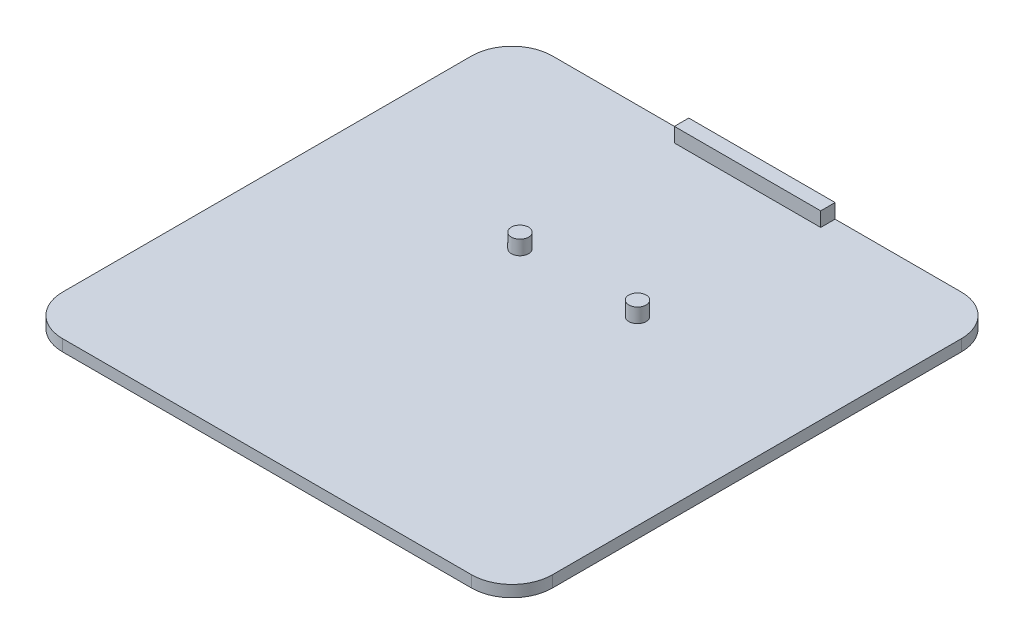
ISO-10303-21;
HEADER;
FILE_DESCRIPTION(('STEP AP214'),'2;1');
FILE_NAME('part.step','',(''),(''),'','','');
FILE_SCHEMA(('AUTOMOTIVE_DESIGN { 1 0 10303 214 1 1 1 1 }'));
ENDSEC;
DATA;
#1=APPLICATION_CONTEXT('core data for automotive mechanical design processes');
#2=APPLICATION_PROTOCOL_DEFINITION('international standard','automotive_design',2000,#1);
#3=PRODUCT_CONTEXT('',#1,'mechanical');
#4=PRODUCT('Part','Part','',(#3));
#5=PRODUCT_RELATED_PRODUCT_CATEGORY('part','',(#4));
#6=PRODUCT_DEFINITION_FORMATION('','',#4);
#7=PRODUCT_DEFINITION_CONTEXT('part definition',#1,'design');
#8=PRODUCT_DEFINITION('design','',#6,#7);
#9=PRODUCT_DEFINITION_SHAPE('','',#8);
#10=(LENGTH_UNIT() NAMED_UNIT(*) SI_UNIT(.MILLI.,.METRE.));
#11=(NAMED_UNIT(*) PLANE_ANGLE_UNIT() SI_UNIT($,.RADIAN.));
#12=(NAMED_UNIT(*) SI_UNIT($,.STERADIAN.) SOLID_ANGLE_UNIT());
#13=UNCERTAINTY_MEASURE_WITH_UNIT(LENGTH_MEASURE(1.E-05),#10,'distance_accuracy_value','');
#14=(GEOMETRIC_REPRESENTATION_CONTEXT(3) GLOBAL_UNCERTAINTY_ASSIGNED_CONTEXT((#13)) GLOBAL_UNIT_ASSIGNED_CONTEXT((#10,
#11,#12)) REPRESENTATION_CONTEXT('',''));
#15=CARTESIAN_POINT('',(0.,0.,0.));
#16=DIRECTION('',(0.,0.,1.));
#17=DIRECTION('',(1.,0.,0.));
#18=AXIS2_PLACEMENT_3D('',#15,#16,#17);
#19=CARTESIAN_POINT('',(-35.8924902419984,2.,-51.4777205308353));
#20=DIRECTION('',(0.,-1.,0.));
#21=DIRECTION('',(0.,0.,-1.));
#22=AXIS2_PLACEMENT_3D('',#19,#20,#21);
#23=PLANE('',#22);
#24=CARTESIAN_POINT('',(-9.71157857923494,2.,-26.6789603219462));
#25=DIRECTION('',(0.,-1.,0.));
#26=DIRECTION('',(0.,0.,-1.));
#27=AXIS2_PLACEMENT_3D('',#24,#25,#26);
#28=CIRCLE('',#27,1.5);
#29=CARTESIAN_POINT('',(-9.71157857923494,2.,-28.1789603219462));
#30=VERTEX_POINT('',#29);
#31=EDGE_CURVE('E41',#30,#30,#28,.F.);
#32=ORIENTED_EDGE('',*,*,#31,.F.);
#33=EDGE_LOOP('',(#32));
#34=FACE_BOUND('',#33,.T.);
#35=CARTESIAN_POINT('',(10.6884214207651,2.,-26.6789603219462));
#36=DIRECTION('',(0.,-1.,0.));
#37=DIRECTION('',(0.,0.,-1.));
#38=AXIS2_PLACEMENT_3D('',#35,#36,#37);
#39=CIRCLE('',#38,1.5);
#40=CARTESIAN_POINT('',(10.6884214207651,2.,-28.1789603219462));
#41=VERTEX_POINT('',#40);
#42=EDGE_CURVE('E11',#41,#41,#39,.F.);
#43=ORIENTED_EDGE('',*,*,#42,.F.);
#44=EDGE_LOOP('',(#43));
#45=FACE_BOUND('',#44,.T.);
#46=DIRECTION('',(0.,0.,1.));
#47=VECTOR('',#46,1.);
#48=CARTESIAN_POINT('',(-12.2115785792349,2.,-58.4777205308353));
#49=LINE('',#48,#47);
#50=CARTESIAN_POINT('',(-12.2115785792349,2.,-58.4777205308353));
#51=VERTEX_POINT('',#50);
#52=CARTESIAN_POINT('',(-12.2115785792349,2.,-55.9777205308353));
#53=VERTEX_POINT('',#52);
#54=EDGE_CURVE('E221',#51,#53,#49,.T.);
#55=ORIENTED_EDGE('',*,*,#54,.F.);
#56=DIRECTION('',(-1.,0.,0.));
#57=VECTOR('',#56,1.);
#58=CARTESIAN_POINT('',(35.1075097580015,2.,-58.4777205308353));
#59=LINE('',#58,#57);
#60=CARTESIAN_POINT('',(-35.8924902419984,2.,-58.4777205308353));
#61=VERTEX_POINT('',#60);
#62=EDGE_CURVE('E143',#51,#61,#59,.T.);
#63=ORIENTED_EDGE('',*,*,#62,.T.);
#64=CARTESIAN_POINT('',(-35.8924902419984,2.,-51.4777205308353));
#65=DIRECTION('',(0.,1.,0.));
#66=DIRECTION('',(0.,0.,-1.));
#67=AXIS2_PLACEMENT_3D('',#64,#65,#66);
#68=CIRCLE('',#67,7.);
#69=CARTESIAN_POINT('',(-42.8924902419984,2.,-51.4777205308353));
#70=VERTEX_POINT('',#69);
#71=EDGE_CURVE('E156',#61,#70,#68,.T.);
#72=ORIENTED_EDGE('',*,*,#71,.T.);
#73=DIRECTION('',(0.,0.,1.));
#74=VECTOR('',#73,1.);
#75=CARTESIAN_POINT('',(-42.8924902419984,2.,-51.4777205308353));
#76=LINE('',#75,#74);
#77=CARTESIAN_POINT('',(-42.8924902419984,2.,19.5222794691647));
#78=VERTEX_POINT('',#77);
#79=EDGE_CURVE('E159',#70,#78,#76,.T.);
#80=ORIENTED_EDGE('',*,*,#79,.T.);
#81=CARTESIAN_POINT('',(-35.8924902419984,2.,19.5222794691647));
#82=DIRECTION('',(0.,1.,0.));
#83=DIRECTION('',(0.,0.,1.));
#84=AXIS2_PLACEMENT_3D('',#81,#82,#83);
#85=CIRCLE('',#84,7.);
#86=CARTESIAN_POINT('',(-35.8924902419984,2.,26.5222794691647));
#87=VERTEX_POINT('',#86);
#88=EDGE_CURVE('E162',#78,#87,#85,.T.);
#89=ORIENTED_EDGE('',*,*,#88,.T.);
#90=DIRECTION('',(1.,0.,0.));
#91=VECTOR('',#90,1.);
#92=CARTESIAN_POINT('',(-35.8924902419984,2.,26.5222794691647));
#93=LINE('',#92,#91);
#94=CARTESIAN_POINT('',(35.1075097580015,2.,26.5222794691647));
#95=VERTEX_POINT('',#94);
#96=EDGE_CURVE('E164',#87,#95,#93,.T.);
#97=ORIENTED_EDGE('',*,*,#96,.T.);
#98=CARTESIAN_POINT('',(35.1075097580016,2.,19.5222794691647));
#99=DIRECTION('',(0.,1.,0.));
#100=DIRECTION('',(0.,0.,1.));
#101=AXIS2_PLACEMENT_3D('',#98,#99,#100);
#102=CIRCLE('',#101,7.);
#103=CARTESIAN_POINT('',(42.1075097580016,2.,19.5222794691647));
#104=VERTEX_POINT('',#103);
#105=EDGE_CURVE('E166',#95,#104,#102,.T.);
#106=ORIENTED_EDGE('',*,*,#105,.T.);
#107=DIRECTION('',(0.,0.,-1.));
#108=VECTOR('',#107,1.);
#109=CARTESIAN_POINT('',(42.1075097580016,2.,19.5222794691647));
#110=LINE('',#109,#108);
#111=CARTESIAN_POINT('',(42.1075097580016,2.,-51.4777205308353));
#112=VERTEX_POINT('',#111);
#113=EDGE_CURVE('E168',#104,#112,#110,.T.);
#114=ORIENTED_EDGE('',*,*,#113,.T.);
#115=CARTESIAN_POINT('',(35.1075097580016,2.,-51.4777205308353));
#116=DIRECTION('',(0.,1.,0.));
#117=DIRECTION('',(0.,0.,1.));
#118=AXIS2_PLACEMENT_3D('',#115,#116,#117);
#119=CIRCLE('',#118,7.);
#120=CARTESIAN_POINT('',(35.1075097580015,2.,-58.4777205308353));
#121=VERTEX_POINT('',#120);
#122=EDGE_CURVE('E170',#112,#121,#119,.T.);
#123=ORIENTED_EDGE('',*,*,#122,.T.);
#124=CARTESIAN_POINT('',(13.1884214207651,2.,-58.4777205308353));
#125=VERTEX_POINT('',#124);
#126=EDGE_CURVE('E172',#121,#125,#59,.T.);
#127=ORIENTED_EDGE('',*,*,#126,.T.);
#128=DIRECTION('',(0.,0.,-1.));
#129=VECTOR('',#128,1.);
#130=CARTESIAN_POINT('',(13.1884214207651,2.,-55.9777205308353));
#131=LINE('',#130,#129);
#132=CARTESIAN_POINT('',(13.1884214207651,2.,-55.9777205308353));
#133=VERTEX_POINT('',#132);
#134=EDGE_CURVE('E53',#133,#125,#131,.T.);
#135=ORIENTED_EDGE('',*,*,#134,.F.);
#136=DIRECTION('',(1.,0.,0.));
#137=VECTOR('',#136,1.);
#138=CARTESIAN_POINT('',(-12.2115785792349,2.,-55.9777205308353));
#139=LINE('',#138,#137);
#140=EDGE_CURVE('E48',#53,#133,#139,.T.);
#141=ORIENTED_EDGE('',*,*,#140,.F.);
#142=EDGE_LOOP('',(#55,#63,#72,#80,#89,#97,#106,#114,#123,#127,#135,#141));
#143=FACE_BOUND('',#142,.T.);
#144=ADVANCED_FACE('F33',(#34,#45,#143),#23,.F.);
#145=CARTESIAN_POINT('',(-35.8924902419984,2.,-51.4777205308353));
#146=DIRECTION('',(0.,-1.,0.));
#147=DIRECTION('',(0.,0.,-1.));
#148=AXIS2_PLACEMENT_3D('',#145,#146,#147);
#149=CYLINDRICAL_SURFACE('',#148,7.);
#150=CARTESIAN_POINT('',(-35.8924902419984,0.,-51.4777205308353));
#151=DIRECTION('',(0.,1.,0.));
#152=DIRECTION('',(0.,0.,-1.));
#153=AXIS2_PLACEMENT_3D('',#150,#151,#152);
#154=CIRCLE('',#153,7.);
#155=CARTESIAN_POINT('',(-35.8924902419984,0.,-58.4777205308353));
#156=VERTEX_POINT('',#155);
#157=CARTESIAN_POINT('',(-42.8924902419984,0.,-51.4777205308353));
#158=VERTEX_POINT('',#157);
#159=EDGE_CURVE('E155',#156,#158,#154,.T.);
#160=ORIENTED_EDGE('',*,*,#159,.T.);
#161=DIRECTION('',(0.,-1.,0.));
#162=VECTOR('',#161,1.);
#163=CARTESIAN_POINT('',(-42.8924902419984,2.,-51.4777205308353));
#164=LINE('',#163,#162);
#165=EDGE_CURVE('E210',#70,#158,#164,.T.);
#166=ORIENTED_EDGE('',*,*,#165,.F.);
#167=ORIENTED_EDGE('',*,*,#71,.F.);
#168=DIRECTION('',(0.,-1.,0.));
#169=VECTOR('',#168,1.);
#170=CARTESIAN_POINT('',(-35.8924902419984,2.,-58.4777205308353));
#171=LINE('',#170,#169);
#172=EDGE_CURVE('E174',#61,#156,#171,.T.);
#173=ORIENTED_EDGE('',*,*,#172,.T.);
#174=EDGE_LOOP('',(#160,#166,#167,#173));
#175=FACE_BOUND('',#174,.T.);
#176=ADVANCED_FACE('F35',(#175),#149,.T.);
#177=CARTESIAN_POINT('',(-42.8924902419984,2.,-51.4777205308353));
#178=DIRECTION('',(1.,0.,0.));
#179=DIRECTION('',(0.,0.,-1.));
#180=AXIS2_PLACEMENT_3D('',#177,#178,#179);
#181=PLANE('',#180);
#182=DIRECTION('',(0.,0.,1.));
#183=VECTOR('',#182,1.);
#184=CARTESIAN_POINT('',(-42.8924902419984,0.,-51.4777205308353));
#185=LINE('',#184,#183);
#186=CARTESIAN_POINT('',(-42.8924902419984,0.,19.5222794691647));
#187=VERTEX_POINT('',#186);
#188=EDGE_CURVE('E177',#158,#187,#185,.T.);
#189=ORIENTED_EDGE('',*,*,#188,.T.);
#190=DIRECTION('',(0.,-1.,0.));
#191=VECTOR('',#190,1.);
#192=CARTESIAN_POINT('',(-42.8924902419984,2.,19.5222794691647));
#193=LINE('',#192,#191);
#194=EDGE_CURVE('E207',#78,#187,#193,.T.);
#195=ORIENTED_EDGE('',*,*,#194,.F.);
#196=ORIENTED_EDGE('',*,*,#79,.F.);
#197=ORIENTED_EDGE('',*,*,#165,.T.);
#198=EDGE_LOOP('',(#189,#195,#196,#197));
#199=FACE_BOUND('',#198,.T.);
#200=ADVANCED_FACE('F284',(#199),#181,.F.);
#201=CARTESIAN_POINT('',(-35.8924902419984,2.,19.5222794691647));
#202=DIRECTION('',(0.,-1.,0.));
#203=DIRECTION('',(0.,0.,-1.));
#204=AXIS2_PLACEMENT_3D('',#201,#202,#203);
#205=CYLINDRICAL_SURFACE('',#204,7.);
#206=CARTESIAN_POINT('',(-35.8924902419984,0.,19.5222794691647));
#207=DIRECTION('',(0.,1.,0.));
#208=DIRECTION('',(0.,0.,1.));
#209=AXIS2_PLACEMENT_3D('',#206,#207,#208);
#210=CIRCLE('',#209,7.);
#211=CARTESIAN_POINT('',(-35.8924902419984,0.,26.5222794691647));
#212=VERTEX_POINT('',#211);
#213=EDGE_CURVE('E179',#187,#212,#210,.T.);
#214=ORIENTED_EDGE('',*,*,#213,.T.);
#215=DIRECTION('',(0.,-1.,0.));
#216=VECTOR('',#215,1.);
#217=CARTESIAN_POINT('',(-35.8924902419984,2.,26.5222794691647));
#218=LINE('',#217,#216);
#219=EDGE_CURVE('E204',#87,#212,#218,.T.);
#220=ORIENTED_EDGE('',*,*,#219,.F.);
#221=ORIENTED_EDGE('',*,*,#88,.F.);
#222=ORIENTED_EDGE('',*,*,#194,.T.);
#223=EDGE_LOOP('',(#214,#220,#221,#222));
#224=FACE_BOUND('',#223,.T.);
#225=ADVANCED_FACE('F281',(#224),#205,.T.);
#226=CARTESIAN_POINT('',(-35.8924902419984,2.,26.5222794691647));
#227=DIRECTION('',(0.,0.,-1.));
#228=DIRECTION('',(-1.,0.,0.));
#229=AXIS2_PLACEMENT_3D('',#226,#227,#228);
#230=PLANE('',#229);
#231=DIRECTION('',(1.,0.,0.));
#232=VECTOR('',#231,1.);
#233=CARTESIAN_POINT('',(-35.8924902419984,0.,26.5222794691647));
#234=LINE('',#233,#232);
#235=CARTESIAN_POINT('',(35.1075097580015,0.,26.5222794691647));
#236=VERTEX_POINT('',#235);
#237=EDGE_CURVE('E181',#212,#236,#234,.T.);
#238=ORIENTED_EDGE('',*,*,#237,.T.);
#239=DIRECTION('',(0.,-1.,0.));
#240=VECTOR('',#239,1.);
#241=CARTESIAN_POINT('',(35.1075097580015,2.,26.5222794691647));
#242=LINE('',#241,#240);
#243=EDGE_CURVE('E201',#95,#236,#242,.T.);
#244=ORIENTED_EDGE('',*,*,#243,.F.);
#245=ORIENTED_EDGE('',*,*,#96,.F.);
#246=ORIENTED_EDGE('',*,*,#219,.T.);
#247=EDGE_LOOP('',(#238,#244,#245,#246));
#248=FACE_BOUND('',#247,.T.);
#249=ADVANCED_FACE('F277',(#248),#230,.F.);
#250=CARTESIAN_POINT('',(35.1075097580016,2.,19.5222794691647));
#251=DIRECTION('',(0.,-1.,0.));
#252=DIRECTION('',(0.,0.,-1.));
#253=AXIS2_PLACEMENT_3D('',#250,#251,#252);
#254=CYLINDRICAL_SURFACE('',#253,7.);
#255=CARTESIAN_POINT('',(35.1075097580016,0.,19.5222794691647));
#256=DIRECTION('',(0.,1.,0.));
#257=DIRECTION('',(0.,0.,1.));
#258=AXIS2_PLACEMENT_3D('',#255,#256,#257);
#259=CIRCLE('',#258,7.);
#260=CARTESIAN_POINT('',(42.1075097580016,0.,19.5222794691647));
#261=VERTEX_POINT('',#260);
#262=EDGE_CURVE('E183',#236,#261,#259,.T.);
#263=ORIENTED_EDGE('',*,*,#262,.T.);
#264=DIRECTION('',(0.,-1.,0.));
#265=VECTOR('',#264,1.);
#266=CARTESIAN_POINT('',(42.1075097580016,2.,19.5222794691647));
#267=LINE('',#266,#265);
#268=EDGE_CURVE('E198',#104,#261,#267,.T.);
#269=ORIENTED_EDGE('',*,*,#268,.F.);
#270=ORIENTED_EDGE('',*,*,#105,.F.);
#271=ORIENTED_EDGE('',*,*,#243,.T.);
#272=EDGE_LOOP('',(#263,#269,#270,#271));
#273=FACE_BOUND('',#272,.T.);
#274=ADVANCED_FACE('F273',(#273),#254,.T.);
#275=CARTESIAN_POINT('',(42.1075097580016,2.,19.5222794691647));
#276=DIRECTION('',(-1.,0.,0.));
#277=DIRECTION('',(0.,0.,1.));
#278=AXIS2_PLACEMENT_3D('',#275,#276,#277);
#279=PLANE('',#278);
#280=DIRECTION('',(0.,0.,-1.));
#281=VECTOR('',#280,1.);
#282=CARTESIAN_POINT('',(42.1075097580016,0.,19.5222794691647));
#283=LINE('',#282,#281);
#284=CARTESIAN_POINT('',(42.1075097580016,0.,-51.4777205308353));
#285=VERTEX_POINT('',#284);
#286=EDGE_CURVE('E185',#261,#285,#283,.T.);
#287=ORIENTED_EDGE('',*,*,#286,.T.);
#288=DIRECTION('',(0.,-1.,0.));
#289=VECTOR('',#288,1.);
#290=CARTESIAN_POINT('',(42.1075097580016,2.,-51.4777205308353));
#291=LINE('',#290,#289);
#292=EDGE_CURVE('E195',#112,#285,#291,.T.);
#293=ORIENTED_EDGE('',*,*,#292,.F.);
#294=ORIENTED_EDGE('',*,*,#113,.F.);
#295=ORIENTED_EDGE('',*,*,#268,.T.);
#296=EDGE_LOOP('',(#287,#293,#294,#295));
#297=FACE_BOUND('',#296,.T.);
#298=ADVANCED_FACE('F269',(#297),#279,.F.);
#299=CARTESIAN_POINT('',(35.1075097580016,2.,-51.4777205308353));
#300=DIRECTION('',(0.,-1.,0.));
#301=DIRECTION('',(0.,0.,-1.));
#302=AXIS2_PLACEMENT_3D('',#299,#300,#301);
#303=CYLINDRICAL_SURFACE('',#302,7.);
#304=CARTESIAN_POINT('',(35.1075097580016,0.,-51.4777205308353));
#305=DIRECTION('',(0.,1.,0.));
#306=DIRECTION('',(0.,0.,1.));
#307=AXIS2_PLACEMENT_3D('',#304,#305,#306);
#308=CIRCLE('',#307,7.);
#309=CARTESIAN_POINT('',(35.1075097580015,0.,-58.4777205308353));
#310=VERTEX_POINT('',#309);
#311=EDGE_CURVE('E187',#285,#310,#308,.T.);
#312=ORIENTED_EDGE('',*,*,#311,.T.);
#313=DIRECTION('',(0.,-1.,0.));
#314=VECTOR('',#313,1.);
#315=CARTESIAN_POINT('',(35.1075097580015,2.,-58.4777205308353));
#316=LINE('',#315,#314);
#317=EDGE_CURVE('E192',#121,#310,#316,.T.);
#318=ORIENTED_EDGE('',*,*,#317,.F.);
#319=ORIENTED_EDGE('',*,*,#122,.F.);
#320=ORIENTED_EDGE('',*,*,#292,.T.);
#321=EDGE_LOOP('',(#312,#318,#319,#320));
#322=FACE_BOUND('',#321,.T.);
#323=ADVANCED_FACE('F266',(#322),#303,.T.);
#324=CARTESIAN_POINT('',(35.1075097580015,2.,-58.4777205308353));
#325=DIRECTION('',(0.,0.,1.));
#326=DIRECTION('',(1.,0.,0.));
#327=AXIS2_PLACEMENT_3D('',#324,#325,#326);
#328=PLANE('',#327);
#329=DIRECTION('',(-1.,0.,0.));
#330=VECTOR('',#329,1.);
#331=CARTESIAN_POINT('',(35.1075097580015,0.,-58.4777205308353));
#332=LINE('',#331,#330);
#333=EDGE_CURVE('E160',#310,#156,#332,.T.);
#334=ORIENTED_EDGE('',*,*,#333,.T.);
#335=ORIENTED_EDGE('',*,*,#172,.F.);
#336=ORIENTED_EDGE('',*,*,#62,.F.);
#337=DIRECTION('',(0.,-1.,0.));
#338=VECTOR('',#337,1.);
#339=CARTESIAN_POINT('',(-12.2115785792349,4.5,-58.4777205308353));
#340=LINE('',#339,#338);
#341=CARTESIAN_POINT('',(-12.2115785792349,4.5,-58.4777205308353));
#342=VERTEX_POINT('',#341);
#343=EDGE_CURVE('E124',#342,#51,#340,.T.);
#344=ORIENTED_EDGE('',*,*,#343,.F.);
#345=DIRECTION('',(-1.,0.,0.));
#346=VECTOR('',#345,1.);
#347=CARTESIAN_POINT('',(13.1884214207651,4.5,-58.4777205308353));
#348=LINE('',#347,#346);
#349=CARTESIAN_POINT('',(13.1884214207651,4.5,-58.4777205308353));
#350=VERTEX_POINT('',#349);
#351=EDGE_CURVE('E130',#350,#342,#348,.T.);
#352=ORIENTED_EDGE('',*,*,#351,.F.);
#353=DIRECTION('',(0.,-1.,0.));
#354=VECTOR('',#353,1.);
#355=CARTESIAN_POINT('',(13.1884214207651,4.5,-58.4777205308353));
#356=LINE('',#355,#354);
#357=EDGE_CURVE('E228',#350,#125,#356,.T.);
#358=ORIENTED_EDGE('',*,*,#357,.T.);
#359=ORIENTED_EDGE('',*,*,#126,.F.);
#360=ORIENTED_EDGE('',*,*,#317,.T.);
#361=EDGE_LOOP('',(#334,#335,#336,#344,#352,#358,#359,#360));
#362=FACE_BOUND('',#361,.T.);
#363=ADVANCED_FACE('F141',(#362),#328,.F.);
#364=CARTESIAN_POINT('',(-35.8924902419984,0.,-51.4777205308353));
#365=DIRECTION('',(0.,-1.,0.));
#366=DIRECTION('',(0.,0.,-1.));
#367=AXIS2_PLACEMENT_3D('',#364,#365,#366);
#368=PLANE('',#367);
#369=ORIENTED_EDGE('',*,*,#159,.F.);
#370=ORIENTED_EDGE('',*,*,#333,.F.);
#371=ORIENTED_EDGE('',*,*,#311,.F.);
#372=ORIENTED_EDGE('',*,*,#286,.F.);
#373=ORIENTED_EDGE('',*,*,#262,.F.);
#374=ORIENTED_EDGE('',*,*,#237,.F.);
#375=ORIENTED_EDGE('',*,*,#213,.F.);
#376=ORIENTED_EDGE('',*,*,#188,.F.);
#377=EDGE_LOOP('',(#369,#370,#371,#372,#373,#374,#375,#376));
#378=FACE_BOUND('',#377,.T.);
#379=ADVANCED_FACE('F258',(#378),#368,.T.);
#380=CARTESIAN_POINT('',(-9.71157857923494,4.5,-26.6789603219462));
#381=DIRECTION('',(0.,-1.,0.));
#382=DIRECTION('',(0.,0.,-1.));
#383=AXIS2_PLACEMENT_3D('',#380,#381,#382);
#384=CYLINDRICAL_SURFACE('',#383,1.5);
#385=CARTESIAN_POINT('',(-9.71157857923494,4.5,-26.6789603219462));
#386=DIRECTION('',(0.,1.,0.));
#387=DIRECTION('',(0.,0.,1.));
#388=AXIS2_PLACEMENT_3D('',#385,#386,#387);
#389=CIRCLE('',#388,1.5);
#390=CARTESIAN_POINT('',(-9.71157857923494,4.5,-25.1789603219463));
#391=VERTEX_POINT('',#390);
#392=EDGE_CURVE('E147',#391,#391,#389,.T.);
#393=ORIENTED_EDGE('',*,*,#392,.F.);
#394=EDGE_LOOP('',(#393));
#395=FACE_BOUND('',#394,.T.);
#396=ORIENTED_EDGE('',*,*,#31,.T.);
#397=EDGE_LOOP('',(#396));
#398=FACE_BOUND('',#397,.T.);
#399=ADVANCED_FACE('F215',(#395,#398),#384,.T.);
#400=CARTESIAN_POINT('',(-9.71157857923494,4.5,-26.6789603219462));
#401=DIRECTION('',(0.,1.,0.));
#402=DIRECTION('',(0.,0.,1.));
#403=AXIS2_PLACEMENT_3D('',#400,#401,#402);
#404=PLANE('',#403);
#405=ORIENTED_EDGE('',*,*,#392,.T.);
#406=EDGE_LOOP('',(#405));
#407=FACE_BOUND('',#406,.T.);
#408=ADVANCED_FACE('F252',(#407),#404,.T.);
#409=CARTESIAN_POINT('',(10.6884214207651,4.5,-26.6789603219462));
#410=DIRECTION('',(0.,-1.,0.));
#411=DIRECTION('',(0.,0.,-1.));
#412=AXIS2_PLACEMENT_3D('',#409,#410,#411);
#413=CYLINDRICAL_SURFACE('',#412,1.5);
#414=CARTESIAN_POINT('',(10.6884214207651,4.5,-26.6789603219462));
#415=DIRECTION('',(0.,1.,0.));
#416=DIRECTION('',(0.,0.,1.));
#417=AXIS2_PLACEMENT_3D('',#414,#415,#416);
#418=CIRCLE('',#417,1.5);
#419=CARTESIAN_POINT('',(10.6884214207651,4.5,-25.1789603219463));
#420=VERTEX_POINT('',#419);
#421=EDGE_CURVE('E144',#420,#420,#418,.T.);
#422=ORIENTED_EDGE('',*,*,#421,.F.);
#423=EDGE_LOOP('',(#422));
#424=FACE_BOUND('',#423,.T.);
#425=ORIENTED_EDGE('',*,*,#42,.T.);
#426=EDGE_LOOP('',(#425));
#427=FACE_BOUND('',#426,.T.);
#428=ADVANCED_FACE('F248',(#424,#427),#413,.T.);
#429=CARTESIAN_POINT('',(10.6884214207651,4.5,-26.6789603219462));
#430=DIRECTION('',(0.,1.,0.));
#431=DIRECTION('',(0.,0.,1.));
#432=AXIS2_PLACEMENT_3D('',#429,#430,#431);
#433=PLANE('',#432);
#434=ORIENTED_EDGE('',*,*,#421,.T.);
#435=EDGE_LOOP('',(#434));
#436=FACE_BOUND('',#435,.T.);
#437=ADVANCED_FACE('F242',(#436),#433,.T.);
#438=CARTESIAN_POINT('',(-12.2115785792349,4.5,-58.4777205308353));
#439=DIRECTION('',(1.,0.,0.));
#440=DIRECTION('',(0.,0.,-1.));
#441=AXIS2_PLACEMENT_3D('',#438,#439,#440);
#442=PLANE('',#441);
#443=ORIENTED_EDGE('',*,*,#54,.T.);
#444=DIRECTION('',(0.,-1.,0.));
#445=VECTOR('',#444,1.);
#446=CARTESIAN_POINT('',(-12.2115785792349,4.5,-55.9777205308353));
#447=LINE('',#446,#445);
#448=CARTESIAN_POINT('',(-12.2115785792349,4.5,-55.9777205308353));
#449=VERTEX_POINT('',#448);
#450=EDGE_CURVE('E126',#449,#53,#447,.T.);
#451=ORIENTED_EDGE('',*,*,#450,.F.);
#452=DIRECTION('',(0.,0.,1.));
#453=VECTOR('',#452,1.);
#454=CARTESIAN_POINT('',(-12.2115785792349,4.5,-58.4777205308353));
#455=LINE('',#454,#453);
#456=EDGE_CURVE('E120',#342,#449,#455,.T.);
#457=ORIENTED_EDGE('',*,*,#456,.F.);
#458=ORIENTED_EDGE('',*,*,#343,.T.);
#459=EDGE_LOOP('',(#443,#451,#457,#458));
#460=FACE_BOUND('',#459,.T.);
#461=ADVANCED_FACE('F122',(#460),#442,.F.);
#462=CARTESIAN_POINT('',(-12.2115785792349,4.5,-55.9777205308353));
#463=DIRECTION('',(0.,0.,-1.));
#464=DIRECTION('',(-1.,0.,0.));
#465=AXIS2_PLACEMENT_3D('',#462,#463,#464);
#466=PLANE('',#465);
#467=ORIENTED_EDGE('',*,*,#140,.T.);
#468=DIRECTION('',(0.,-1.,0.));
#469=VECTOR('',#468,1.);
#470=CARTESIAN_POINT('',(13.1884214207651,4.5,-55.9777205308353));
#471=LINE('',#470,#469);
#472=CARTESIAN_POINT('',(13.1884214207651,4.5,-55.9777205308353));
#473=VERTEX_POINT('',#472);
#474=EDGE_CURVE('E149',#473,#133,#471,.T.);
#475=ORIENTED_EDGE('',*,*,#474,.F.);
#476=DIRECTION('',(1.,0.,0.));
#477=VECTOR('',#476,1.);
#478=CARTESIAN_POINT('',(-12.2115785792349,4.5,-55.9777205308353));
#479=LINE('',#478,#477);
#480=EDGE_CURVE('E129',#449,#473,#479,.T.);
#481=ORIENTED_EDGE('',*,*,#480,.F.);
#482=ORIENTED_EDGE('',*,*,#450,.T.);
#483=EDGE_LOOP('',(#467,#475,#481,#482));
#484=FACE_BOUND('',#483,.T.);
#485=ADVANCED_FACE('F234',(#484),#466,.F.);
#486=CARTESIAN_POINT('',(13.1884214207651,4.5,-55.9777205308353));
#487=DIRECTION('',(-1.,0.,0.));
#488=DIRECTION('',(0.,0.,1.));
#489=AXIS2_PLACEMENT_3D('',#486,#487,#488);
#490=PLANE('',#489);
#491=ORIENTED_EDGE('',*,*,#134,.T.);
#492=ORIENTED_EDGE('',*,*,#357,.F.);
#493=DIRECTION('',(0.,0.,-1.));
#494=VECTOR('',#493,1.);
#495=CARTESIAN_POINT('',(13.1884214207651,4.5,-55.9777205308353));
#496=LINE('',#495,#494);
#497=EDGE_CURVE('E135',#473,#350,#496,.T.);
#498=ORIENTED_EDGE('',*,*,#497,.F.);
#499=ORIENTED_EDGE('',*,*,#474,.T.);
#500=EDGE_LOOP('',(#491,#492,#498,#499));
#501=FACE_BOUND('',#500,.T.);
#502=ADVANCED_FACE('F232',(#501),#490,.F.);
#503=CARTESIAN_POINT('',(0.,4.5,0.));
#504=DIRECTION('',(0.,1.,0.));
#505=DIRECTION('',(0.,0.,1.));
#506=AXIS2_PLACEMENT_3D('',#503,#504,#505);
#507=PLANE('',#506);
#508=ORIENTED_EDGE('',*,*,#351,.T.);
#509=ORIENTED_EDGE('',*,*,#456,.T.);
#510=ORIENTED_EDGE('',*,*,#480,.T.);
#511=ORIENTED_EDGE('',*,*,#497,.T.);
#512=EDGE_LOOP('',(#508,#509,#510,#511));
#513=FACE_BOUND('',#512,.T.);
#514=ADVANCED_FACE('F133',(#513),#507,.T.);
#515=CLOSED_SHELL('',(#144,#176,#200,#225,#249,#274,#298,#323,#363,#379,#399,#408,#428,#437,
#461,#485,#502,#514));
#516=MANIFOLD_SOLID_BREP('B2',#515);
#517=ADVANCED_BREP_SHAPE_REPRESENTATION('',(#18,#516),#14);
#518=SHAPE_DEFINITION_REPRESENTATION(#9,#517);
ENDSEC;
END-ISO-10303-21;
